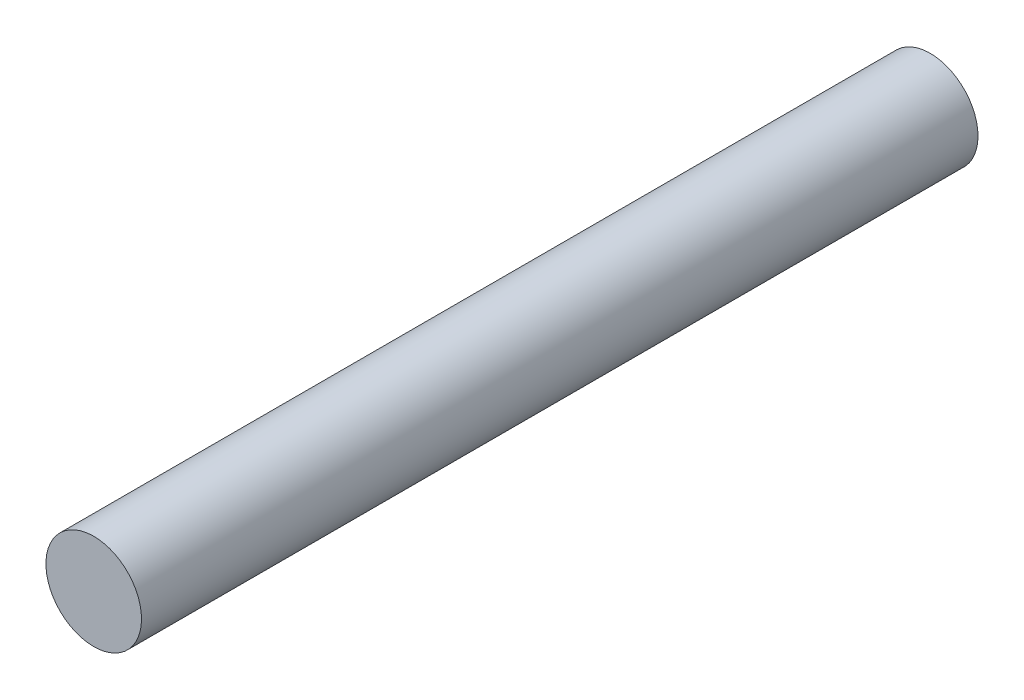
ISO-10303-21;
HEADER;
FILE_DESCRIPTION(('STEP AP214'),'2;1');
FILE_NAME('part.step','',(''),(''),'','','');
FILE_SCHEMA(('AUTOMOTIVE_DESIGN { 1 0 10303 214 1 1 1 1 }'));
ENDSEC;
DATA;
#1=APPLICATION_CONTEXT('core data for automotive mechanical design processes');
#2=APPLICATION_PROTOCOL_DEFINITION('international standard','automotive_design',2000,#1);
#3=PRODUCT_CONTEXT('',#1,'mechanical');
#4=PRODUCT('Part','Part','',(#3));
#5=PRODUCT_RELATED_PRODUCT_CATEGORY('part','',(#4));
#6=PRODUCT_DEFINITION_FORMATION('','',#4);
#7=PRODUCT_DEFINITION_CONTEXT('part definition',#1,'design');
#8=PRODUCT_DEFINITION('design','',#6,#7);
#9=PRODUCT_DEFINITION_SHAPE('','',#8);
#10=(LENGTH_UNIT() NAMED_UNIT(*) SI_UNIT(.MILLI.,.METRE.));
#11=(NAMED_UNIT(*) PLANE_ANGLE_UNIT() SI_UNIT($,.RADIAN.));
#12=(NAMED_UNIT(*) SI_UNIT($,.STERADIAN.) SOLID_ANGLE_UNIT());
#13=UNCERTAINTY_MEASURE_WITH_UNIT(LENGTH_MEASURE(1.E-05),#10,'distance_accuracy_value','');
#14=(GEOMETRIC_REPRESENTATION_CONTEXT(3) GLOBAL_UNCERTAINTY_ASSIGNED_CONTEXT((#13)) GLOBAL_UNIT_ASSIGNED_CONTEXT((#10,
#11,#12)) REPRESENTATION_CONTEXT('',''));
#15=CARTESIAN_POINT('',(0.,0.,0.));
#16=DIRECTION('',(0.,0.,1.));
#17=DIRECTION('',(1.,0.,0.));
#18=AXIS2_PLACEMENT_3D('',#15,#16,#17);
#19=CARTESIAN_POINT('',(0.,0.,35.));
#20=DIRECTION('',(0.,0.,-1.));
#21=DIRECTION('',(-1.,0.,0.));
#22=AXIS2_PLACEMENT_3D('',#19,#20,#21);
#23=CYLINDRICAL_SURFACE('',#22,2.);
#24=CARTESIAN_POINT('',(0.,0.,35.));
#25=DIRECTION('',(0.,0.,1.));
#26=DIRECTION('',(1.,0.,0.));
#27=AXIS2_PLACEMENT_3D('',#24,#25,#26);
#28=CIRCLE('',#27,2.);
#29=CARTESIAN_POINT('',(2.,0.,35.));
#30=VERTEX_POINT('',#29);
#31=EDGE_CURVE('E10',#30,#30,#28,.T.);
#32=ORIENTED_EDGE('',*,*,#31,.F.);
#33=EDGE_LOOP('',(#32));
#34=FACE_BOUND('',#33,.T.);
#35=CARTESIAN_POINT('',(0.,0.,0.));
#36=DIRECTION('',(0.,0.,1.));
#37=DIRECTION('',(1.,0.,0.));
#38=AXIS2_PLACEMENT_3D('',#35,#36,#37);
#39=CIRCLE('',#38,2.);
#40=CARTESIAN_POINT('',(2.,0.,0.));
#41=VERTEX_POINT('',#40);
#42=EDGE_CURVE('E40',#41,#41,#39,.T.);
#43=ORIENTED_EDGE('',*,*,#42,.T.);
#44=EDGE_LOOP('',(#43));
#45=FACE_BOUND('',#44,.T.);
#46=ADVANCED_FACE('F37',(#34,#45),#23,.T.);
#47=CARTESIAN_POINT('',(0.,0.,35.));
#48=DIRECTION('',(0.,0.,1.));
#49=DIRECTION('',(1.,0.,0.));
#50=AXIS2_PLACEMENT_3D('',#47,#48,#49);
#51=PLANE('',#50);
#52=ORIENTED_EDGE('',*,*,#31,.T.);
#53=EDGE_LOOP('',(#52));
#54=FACE_BOUND('',#53,.T.);
#55=ADVANCED_FACE('F54',(#54),#51,.T.);
#56=CARTESIAN_POINT('',(0.,0.,0.));
#57=DIRECTION('',(0.,0.,1.));
#58=DIRECTION('',(1.,0.,0.));
#59=AXIS2_PLACEMENT_3D('',#56,#57,#58);
#60=PLANE('',#59);
#61=ORIENTED_EDGE('',*,*,#42,.F.);
#62=EDGE_LOOP('',(#61));
#63=FACE_BOUND('',#62,.T.);
#64=ADVANCED_FACE('F52',(#63),#60,.F.);
#65=CLOSED_SHELL('',(#46,#55,#64));
#66=MANIFOLD_SOLID_BREP('B2',#65);
#67=ADVANCED_BREP_SHAPE_REPRESENTATION('',(#18,#66),#14);
#68=SHAPE_DEFINITION_REPRESENTATION(#9,#67);
ENDSEC;
END-ISO-10303-21;
